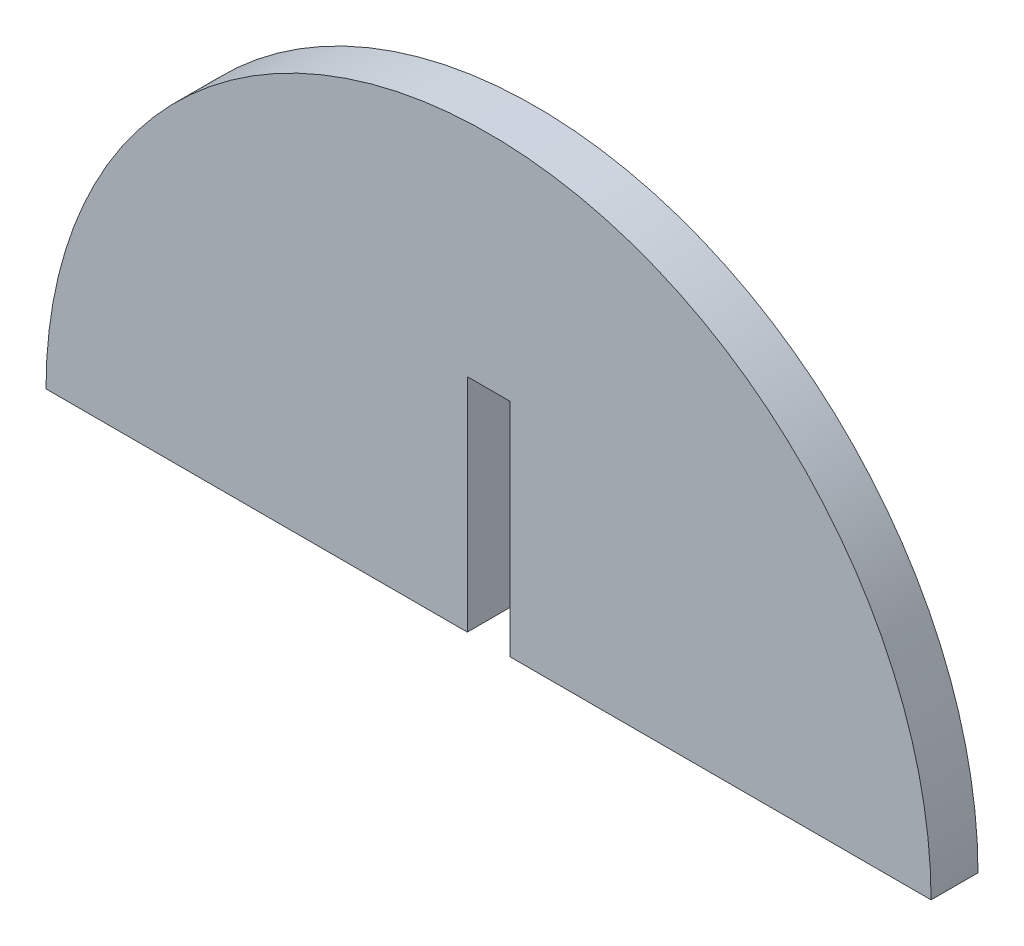
ISO-10303-21;
HEADER;
FILE_DESCRIPTION(('STEP AP214'),'2;1');
FILE_NAME('part.step','',(''),(''),'','','');
FILE_SCHEMA(('AUTOMOTIVE_DESIGN { 1 0 10303 214 1 1 1 1 }'));
ENDSEC;
DATA;
#1=APPLICATION_CONTEXT('core data for automotive mechanical design processes');
#2=APPLICATION_PROTOCOL_DEFINITION('international standard','automotive_design',2000,#1);
#3=PRODUCT_CONTEXT('',#1,'mechanical');
#4=PRODUCT('Part','Part','',(#3));
#5=PRODUCT_RELATED_PRODUCT_CATEGORY('part','',(#4));
#6=PRODUCT_DEFINITION_FORMATION('','',#4);
#7=PRODUCT_DEFINITION_CONTEXT('part definition',#1,'design');
#8=PRODUCT_DEFINITION('design','',#6,#7);
#9=PRODUCT_DEFINITION_SHAPE('','',#8);
#10=(LENGTH_UNIT() NAMED_UNIT(*) SI_UNIT(.MILLI.,.METRE.));
#11=(NAMED_UNIT(*) PLANE_ANGLE_UNIT() SI_UNIT($,.RADIAN.));
#12=(NAMED_UNIT(*) SI_UNIT($,.STERADIAN.) SOLID_ANGLE_UNIT());
#13=UNCERTAINTY_MEASURE_WITH_UNIT(LENGTH_MEASURE(1.E-05),#10,'distance_accuracy_value','');
#14=(GEOMETRIC_REPRESENTATION_CONTEXT(3) GLOBAL_UNCERTAINTY_ASSIGNED_CONTEXT((#13)) GLOBAL_UNIT_ASSIGNED_CONTEXT((#10,
#11,#12)) REPRESENTATION_CONTEXT('',''));
#15=CARTESIAN_POINT('',(0.,0.,0.));
#16=DIRECTION('',(0.,0.,1.));
#17=DIRECTION('',(1.,0.,0.));
#18=AXIS2_PLACEMENT_3D('',#15,#16,#17);
#19=CARTESIAN_POINT('',(0.,0.,2.6924));
#20=DIRECTION('',(0.,0.,-1.));
#21=DIRECTION('',(-1.,0.,0.));
#22=AXIS2_PLACEMENT_3D('',#19,#20,#21);
#23=CYLINDRICAL_SURFACE('',#22,25.4);
#24=CARTESIAN_POINT('',(0.,0.,0.));
#25=DIRECTION('',(0.,0.,1.));
#26=DIRECTION('',(-1.,0.,0.));
#27=AXIS2_PLACEMENT_3D('',#24,#25,#26);
#28=CIRCLE('',#27,25.4);
#29=CARTESIAN_POINT('',(25.4,0.,0.));
#30=VERTEX_POINT('',#29);
#31=CARTESIAN_POINT('',(-25.4,0.,0.));
#32=VERTEX_POINT('',#31);
#33=EDGE_CURVE('E122',#30,#32,#28,.T.);
#34=ORIENTED_EDGE('',*,*,#33,.T.);
#35=DIRECTION('',(0.,0.,-1.));
#36=VECTOR('',#35,1.);
#37=CARTESIAN_POINT('',(-25.4,0.,2.6924));
#38=LINE('',#37,#36);
#39=CARTESIAN_POINT('',(-25.4,0.,2.6924));
#40=VERTEX_POINT('',#39);
#41=EDGE_CURVE('E11',#40,#32,#38,.T.);
#42=ORIENTED_EDGE('',*,*,#41,.F.);
#43=CARTESIAN_POINT('',(0.,0.,2.6924));
#44=DIRECTION('',(0.,0.,1.));
#45=DIRECTION('',(-1.,0.,0.));
#46=AXIS2_PLACEMENT_3D('',#43,#44,#45);
#47=CIRCLE('',#46,25.4);
#48=CARTESIAN_POINT('',(25.4,0.,2.6924));
#49=VERTEX_POINT('',#48);
#50=EDGE_CURVE('E134',#49,#40,#47,.T.);
#51=ORIENTED_EDGE('',*,*,#50,.F.);
#52=DIRECTION('',(0.,0.,-1.));
#53=VECTOR('',#52,1.);
#54=CARTESIAN_POINT('',(25.4,0.,2.6924));
#55=LINE('',#54,#53);
#56=EDGE_CURVE('E116',#49,#30,#55,.T.);
#57=ORIENTED_EDGE('',*,*,#56,.T.);
#58=EDGE_LOOP('',(#34,#42,#51,#57));
#59=FACE_BOUND('',#58,.T.);
#60=ADVANCED_FACE('F39',(#59),#23,.T.);
#61=CARTESIAN_POINT('',(-25.4,0.,2.6924));
#62=DIRECTION('',(0.,1.,0.));
#63=DIRECTION('',(-1.,0.,0.));
#64=AXIS2_PLACEMENT_3D('',#61,#62,#63);
#65=PLANE('',#64);
#66=DIRECTION('',(1.,0.,0.));
#67=VECTOR('',#66,1.);
#68=CARTESIAN_POINT('',(-25.4,0.,0.));
#69=LINE('',#68,#67);
#70=CARTESIAN_POINT('',(-1.2192,0.,0.));
#71=VERTEX_POINT('',#70);
#72=EDGE_CURVE('E127',#32,#71,#69,.T.);
#73=ORIENTED_EDGE('',*,*,#72,.T.);
#74=DIRECTION('',(0.,0.,-1.));
#75=VECTOR('',#74,1.);
#76=CARTESIAN_POINT('',(-1.2192,0.,2.6924));
#77=LINE('',#76,#75);
#78=CARTESIAN_POINT('',(-1.2192,0.,2.6924));
#79=VERTEX_POINT('',#78);
#80=EDGE_CURVE('E50',#79,#71,#77,.T.);
#81=ORIENTED_EDGE('',*,*,#80,.F.);
#82=DIRECTION('',(1.,0.,0.));
#83=VECTOR('',#82,1.);
#84=CARTESIAN_POINT('',(-25.4,0.,2.6924));
#85=LINE('',#84,#83);
#86=EDGE_CURVE('E95',#40,#79,#85,.T.);
#87=ORIENTED_EDGE('',*,*,#86,.F.);
#88=ORIENTED_EDGE('',*,*,#41,.T.);
#89=EDGE_LOOP('',(#73,#81,#87,#88));
#90=FACE_BOUND('',#89,.T.);
#91=ADVANCED_FACE('F160',(#90),#65,.F.);
#92=CARTESIAN_POINT('',(-1.2192,0.,2.6924));
#93=DIRECTION('',(-1.,0.,0.));
#94=DIRECTION('',(0.,0.,1.));
#95=AXIS2_PLACEMENT_3D('',#92,#93,#94);
#96=PLANE('',#95);
#97=DIRECTION('',(0.,1.,0.));
#98=VECTOR('',#97,1.);
#99=CARTESIAN_POINT('',(-1.2192,0.,0.));
#100=LINE('',#99,#98);
#101=CARTESIAN_POINT('',(-1.2192,12.7,0.));
#102=VERTEX_POINT('',#101);
#103=EDGE_CURVE('E126',#71,#102,#100,.T.);
#104=ORIENTED_EDGE('',*,*,#103,.T.);
#105=DIRECTION('',(0.,0.,-1.));
#106=VECTOR('',#105,1.);
#107=CARTESIAN_POINT('',(-1.2192,12.7,2.6924));
#108=LINE('',#107,#106);
#109=CARTESIAN_POINT('',(-1.2192,12.7,2.6924));
#110=VERTEX_POINT('',#109);
#111=EDGE_CURVE('E111',#110,#102,#108,.T.);
#112=ORIENTED_EDGE('',*,*,#111,.F.);
#113=DIRECTION('',(0.,1.,0.));
#114=VECTOR('',#113,1.);
#115=CARTESIAN_POINT('',(-1.2192,0.,2.6924));
#116=LINE('',#115,#114);
#117=EDGE_CURVE('E104',#79,#110,#116,.T.);
#118=ORIENTED_EDGE('',*,*,#117,.F.);
#119=ORIENTED_EDGE('',*,*,#80,.T.);
#120=EDGE_LOOP('',(#104,#112,#118,#119));
#121=FACE_BOUND('',#120,.T.);
#122=ADVANCED_FACE('F140',(#121),#96,.F.);
#123=CARTESIAN_POINT('',(-1.2192,12.7,2.6924));
#124=DIRECTION('',(0.,1.,0.));
#125=DIRECTION('',(0.,0.,1.));
#126=AXIS2_PLACEMENT_3D('',#123,#124,#125);
#127=PLANE('',#126);
#128=DIRECTION('',(1.,0.,0.));
#129=VECTOR('',#128,1.);
#130=CARTESIAN_POINT('',(-1.2192,12.7,0.));
#131=LINE('',#130,#129);
#132=CARTESIAN_POINT('',(1.2192,12.7,0.));
#133=VERTEX_POINT('',#132);
#134=EDGE_CURVE('E114',#102,#133,#131,.T.);
#135=ORIENTED_EDGE('',*,*,#134,.T.);
#136=DIRECTION('',(0.,0.,-1.));
#137=VECTOR('',#136,1.);
#138=CARTESIAN_POINT('',(1.2192,12.7,2.6924));
#139=LINE('',#138,#137);
#140=CARTESIAN_POINT('',(1.2192,12.7,2.6924));
#141=VERTEX_POINT('',#140);
#142=EDGE_CURVE('E109',#141,#133,#139,.T.);
#143=ORIENTED_EDGE('',*,*,#142,.F.);
#144=DIRECTION('',(1.,0.,0.));
#145=VECTOR('',#144,1.);
#146=CARTESIAN_POINT('',(-1.2192,12.7,2.6924));
#147=LINE('',#146,#145);
#148=EDGE_CURVE('E97',#110,#141,#147,.T.);
#149=ORIENTED_EDGE('',*,*,#148,.F.);
#150=ORIENTED_EDGE('',*,*,#111,.T.);
#151=EDGE_LOOP('',(#135,#143,#149,#150));
#152=FACE_BOUND('',#151,.T.);
#153=ADVANCED_FACE('F112',(#152),#127,.F.);
#154=CARTESIAN_POINT('',(1.2192,12.7,2.6924));
#155=DIRECTION('',(1.,0.,0.));
#156=DIRECTION('',(0.,0.,-1.));
#157=AXIS2_PLACEMENT_3D('',#154,#155,#156);
#158=PLANE('',#157);
#159=DIRECTION('',(0.,-1.,0.));
#160=VECTOR('',#159,1.);
#161=CARTESIAN_POINT('',(1.2192,12.7,0.));
#162=LINE('',#161,#160);
#163=CARTESIAN_POINT('',(1.2192,0.,0.));
#164=VERTEX_POINT('',#163);
#165=EDGE_CURVE('E79',#133,#164,#162,.T.);
#166=ORIENTED_EDGE('',*,*,#165,.T.);
#167=DIRECTION('',(0.,0.,-1.));
#168=VECTOR('',#167,1.);
#169=CARTESIAN_POINT('',(1.2192,0.,2.6924));
#170=LINE('',#169,#168);
#171=CARTESIAN_POINT('',(1.2192,0.,2.6924));
#172=VERTEX_POINT('',#171);
#173=EDGE_CURVE('E113',#172,#164,#170,.T.);
#174=ORIENTED_EDGE('',*,*,#173,.F.);
#175=DIRECTION('',(0.,-1.,0.));
#176=VECTOR('',#175,1.);
#177=CARTESIAN_POINT('',(1.2192,12.7,2.6924));
#178=LINE('',#177,#176);
#179=EDGE_CURVE('E103',#141,#172,#178,.T.);
#180=ORIENTED_EDGE('',*,*,#179,.F.);
#181=ORIENTED_EDGE('',*,*,#142,.T.);
#182=EDGE_LOOP('',(#166,#174,#180,#181));
#183=FACE_BOUND('',#182,.T.);
#184=ADVANCED_FACE('F120',(#183),#158,.F.);
#185=CARTESIAN_POINT('',(1.2192,0.,2.6924));
#186=DIRECTION('',(0.,1.,0.));
#187=DIRECTION('',(-1.,0.,0.));
#188=AXIS2_PLACEMENT_3D('',#185,#186,#187);
#189=PLANE('',#188);
#190=DIRECTION('',(1.,0.,0.));
#191=VECTOR('',#190,1.);
#192=CARTESIAN_POINT('',(1.2192,0.,0.));
#193=LINE('',#192,#191);
#194=EDGE_CURVE('E85',#164,#30,#193,.T.);
#195=ORIENTED_EDGE('',*,*,#194,.T.);
#196=ORIENTED_EDGE('',*,*,#56,.F.);
#197=DIRECTION('',(1.,0.,0.));
#198=VECTOR('',#197,1.);
#199=CARTESIAN_POINT('',(1.2192,0.,2.6924));
#200=LINE('',#199,#198);
#201=EDGE_CURVE('E54',#172,#49,#200,.T.);
#202=ORIENTED_EDGE('',*,*,#201,.F.);
#203=ORIENTED_EDGE('',*,*,#173,.T.);
#204=EDGE_LOOP('',(#195,#196,#202,#203));
#205=FACE_BOUND('',#204,.T.);
#206=ADVANCED_FACE('F148',(#205),#189,.F.);
#207=CARTESIAN_POINT('',(0.,0.,2.6924));
#208=DIRECTION('',(0.,0.,-1.));
#209=DIRECTION('',(-1.,0.,0.));
#210=AXIS2_PLACEMENT_3D('',#207,#208,#209);
#211=PLANE('',#210);
#212=ORIENTED_EDGE('',*,*,#50,.T.);
#213=ORIENTED_EDGE('',*,*,#86,.T.);
#214=ORIENTED_EDGE('',*,*,#117,.T.);
#215=ORIENTED_EDGE('',*,*,#148,.T.);
#216=ORIENTED_EDGE('',*,*,#179,.T.);
#217=ORIENTED_EDGE('',*,*,#201,.T.);
#218=EDGE_LOOP('',(#212,#213,#214,#215,#216,#217));
#219=FACE_BOUND('',#218,.T.);
#220=ADVANCED_FACE('F101',(#219),#211,.F.);
#221=CARTESIAN_POINT('',(0.,0.,0.));
#222=DIRECTION('',(0.,0.,-1.));
#223=DIRECTION('',(-1.,0.,0.));
#224=AXIS2_PLACEMENT_3D('',#221,#222,#223);
#225=PLANE('',#224);
#226=ORIENTED_EDGE('',*,*,#33,.F.);
#227=ORIENTED_EDGE('',*,*,#194,.F.);
#228=ORIENTED_EDGE('',*,*,#165,.F.);
#229=ORIENTED_EDGE('',*,*,#134,.F.);
#230=ORIENTED_EDGE('',*,*,#103,.F.);
#231=ORIENTED_EDGE('',*,*,#72,.F.);
#232=EDGE_LOOP('',(#226,#227,#228,#229,#230,#231));
#233=FACE_BOUND('',#232,.T.);
#234=ADVANCED_FACE('F142',(#233),#225,.T.);
#235=CLOSED_SHELL('',(#60,#91,#122,#153,#184,#206,#220,#234));
#236=MANIFOLD_SOLID_BREP('B2',#235);
#237=ADVANCED_BREP_SHAPE_REPRESENTATION('',(#18,#236),#14);
#238=SHAPE_DEFINITION_REPRESENTATION(#9,#237);
ENDSEC;
END-ISO-10303-21;
